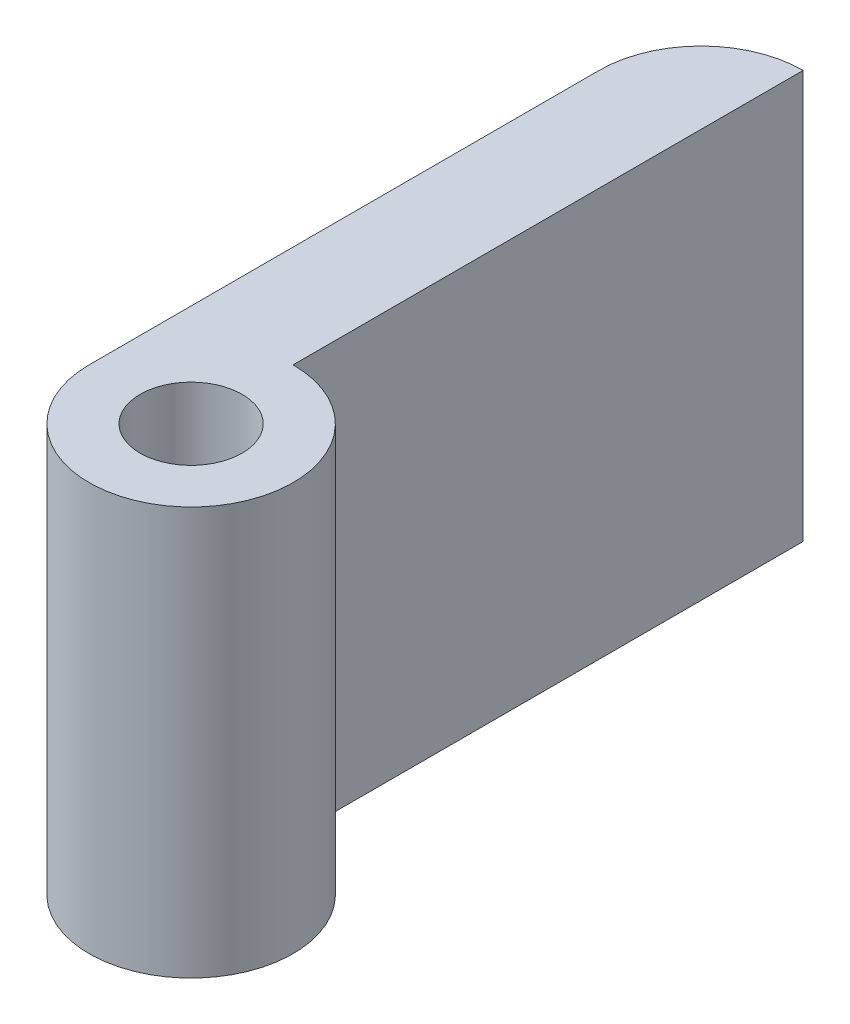
ISO-10303-21;
HEADER;
FILE_DESCRIPTION(('STEP AP214'),'2;1');
FILE_NAME('part.step','',(''),(''),'','','');
FILE_SCHEMA(('AUTOMOTIVE_DESIGN { 1 0 10303 214 1 1 1 1 }'));
ENDSEC;
DATA;
#1=APPLICATION_CONTEXT('core data for automotive mechanical design processes');
#2=APPLICATION_PROTOCOL_DEFINITION('international standard','automotive_design',2000,#1);
#3=PRODUCT_CONTEXT('',#1,'mechanical');
#4=PRODUCT('Part','Part','',(#3));
#5=PRODUCT_RELATED_PRODUCT_CATEGORY('part','',(#4));
#6=PRODUCT_DEFINITION_FORMATION('','',#4);
#7=PRODUCT_DEFINITION_CONTEXT('part definition',#1,'design');
#8=PRODUCT_DEFINITION('design','',#6,#7);
#9=PRODUCT_DEFINITION_SHAPE('','',#8);
#10=(LENGTH_UNIT() NAMED_UNIT(*) SI_UNIT(.MILLI.,.METRE.));
#11=(NAMED_UNIT(*) PLANE_ANGLE_UNIT() SI_UNIT($,.RADIAN.));
#12=(NAMED_UNIT(*) SI_UNIT($,.STERADIAN.) SOLID_ANGLE_UNIT());
#13=UNCERTAINTY_MEASURE_WITH_UNIT(LENGTH_MEASURE(1.E-05),#10,'distance_accuracy_value','');
#14=(GEOMETRIC_REPRESENTATION_CONTEXT(3) GLOBAL_UNCERTAINTY_ASSIGNED_CONTEXT((#13)) GLOBAL_UNIT_ASSIGNED_CONTEXT((#10,
#11,#12)) REPRESENTATION_CONTEXT('',''));
#15=CARTESIAN_POINT('',(0.,0.,0.));
#16=DIRECTION('',(0.,0.,1.));
#17=DIRECTION('',(1.,0.,0.));
#18=AXIS2_PLACEMENT_3D('',#15,#16,#17);
#19=CARTESIAN_POINT('',(0.,20.,0.));
#20=DIRECTION('',(0.,1.,0.));
#21=DIRECTION('',(0.,0.,1.));
#22=AXIS2_PLACEMENT_3D('',#19,#20,#21);
#23=PLANE('',#22);
#24=DIRECTION('',(0.,0.,-1.));
#25=VECTOR('',#24,1.);
#26=CARTESIAN_POINT('',(0.,20.,-30.));
#27=LINE('',#26,#25);
#28=CARTESIAN_POINT('',(0.,20.,-5.00000000000001));
#29=VERTEX_POINT('',#28);
#30=CARTESIAN_POINT('',(0.,20.,-30.));
#31=VERTEX_POINT('',#30);
#32=EDGE_CURVE('E94',#29,#31,#27,.T.);
#33=ORIENTED_EDGE('',*,*,#32,.T.);
#34=CARTESIAN_POINT('',(0.,20.,-25.));
#35=DIRECTION('',(0.,1.,0.));
#36=DIRECTION('',(0.,0.,1.));
#37=AXIS2_PLACEMENT_3D('',#34,#35,#36);
#38=CIRCLE('',#37,5.);
#39=CARTESIAN_POINT('',(-5.,20.,-25.));
#40=VERTEX_POINT('',#39);
#41=EDGE_CURVE('E11',#31,#40,#38,.T.);
#42=ORIENTED_EDGE('',*,*,#41,.T.);
#43=DIRECTION('',(0.,0.,1.));
#44=VECTOR('',#43,1.);
#45=CARTESIAN_POINT('',(-5.,20.,-5.));
#46=LINE('',#45,#44);
#47=CARTESIAN_POINT('',(-5.,20.,0.));
#48=VERTEX_POINT('',#47);
#49=EDGE_CURVE('E72',#40,#48,#46,.T.);
#50=ORIENTED_EDGE('',*,*,#49,.T.);
#51=CARTESIAN_POINT('',(0.,20.,0.));
#52=DIRECTION('',(0.,1.,0.));
#53=DIRECTION('',(0.,0.,1.));
#54=AXIS2_PLACEMENT_3D('',#51,#52,#53);
#55=CIRCLE('',#54,5.);
#56=EDGE_CURVE('E76',#48,#29,#55,.T.);
#57=ORIENTED_EDGE('',*,*,#56,.T.);
#58=EDGE_LOOP('',(#33,#42,#50,#57));
#59=FACE_BOUND('',#58,.T.);
#60=CARTESIAN_POINT('',(0.,20.,0.));
#61=DIRECTION('',(0.,1.,0.));
#62=DIRECTION('',(0.,0.,1.));
#63=AXIS2_PLACEMENT_3D('',#60,#61,#62);
#64=CIRCLE('',#63,2.5);
#65=CARTESIAN_POINT('',(0.,20.,2.5));
#66=VERTEX_POINT('',#65);
#67=EDGE_CURVE('E102',#66,#66,#64,.T.);
#68=ORIENTED_EDGE('',*,*,#67,.F.);
#69=EDGE_LOOP('',(#68));
#70=FACE_BOUND('',#69,.T.);
#71=ADVANCED_FACE('F36',(#59,#70),#23,.T.);
#72=CARTESIAN_POINT('',(0.,0.,0.));
#73=DIRECTION('',(0.,1.,0.));
#74=DIRECTION('',(0.,0.,1.));
#75=AXIS2_PLACEMENT_3D('',#72,#73,#74);
#76=PLANE('',#75);
#77=DIRECTION('',(0.,0.,1.));
#78=VECTOR('',#77,1.);
#79=CARTESIAN_POINT('',(-5.,0.,0.));
#80=LINE('',#79,#78);
#81=CARTESIAN_POINT('',(-5.,0.,-25.));
#82=VERTEX_POINT('',#81);
#83=CARTESIAN_POINT('',(-5.,0.,0.));
#84=VERTEX_POINT('',#83);
#85=EDGE_CURVE('E85',#82,#84,#80,.T.);
#86=ORIENTED_EDGE('',*,*,#85,.F.);
#87=CARTESIAN_POINT('',(0.,0.,-25.));
#88=DIRECTION('',(0.,1.,0.));
#89=DIRECTION('',(0.,0.,1.));
#90=AXIS2_PLACEMENT_3D('',#87,#88,#89);
#91=CIRCLE('',#90,5.);
#92=CARTESIAN_POINT('',(0.,0.,-30.));
#93=VERTEX_POINT('',#92);
#94=EDGE_CURVE('E44',#82,#93,#91,.F.);
#95=ORIENTED_EDGE('',*,*,#94,.T.);
#96=DIRECTION('',(0.,0.,-1.));
#97=VECTOR('',#96,1.);
#98=CARTESIAN_POINT('',(0.,0.,-30.));
#99=LINE('',#98,#97);
#100=CARTESIAN_POINT('',(0.,0.,-5.00000000000001));
#101=VERTEX_POINT('',#100);
#102=EDGE_CURVE('E79',#101,#93,#99,.T.);
#103=ORIENTED_EDGE('',*,*,#102,.F.);
#104=CARTESIAN_POINT('',(0.,0.,0.));
#105=DIRECTION('',(0.,1.,0.));
#106=DIRECTION('',(0.,0.,1.));
#107=AXIS2_PLACEMENT_3D('',#104,#105,#106);
#108=CIRCLE('',#107,5.);
#109=EDGE_CURVE('E101',#84,#101,#108,.T.);
#110=ORIENTED_EDGE('',*,*,#109,.F.);
#111=EDGE_LOOP('',(#86,#95,#103,#110));
#112=FACE_BOUND('',#111,.T.);
#113=CARTESIAN_POINT('',(0.,0.,0.));
#114=DIRECTION('',(0.,1.,0.));
#115=DIRECTION('',(0.,0.,1.));
#116=AXIS2_PLACEMENT_3D('',#113,#114,#115);
#117=CIRCLE('',#116,2.5);
#118=CARTESIAN_POINT('',(0.,0.,2.5));
#119=VERTEX_POINT('',#118);
#120=EDGE_CURVE('E179',#119,#119,#117,.T.);
#121=ORIENTED_EDGE('',*,*,#120,.T.);
#122=EDGE_LOOP('',(#121));
#123=FACE_BOUND('',#122,.T.);
#124=ADVANCED_FACE('F110',(#112,#123),#76,.F.);
#125=CARTESIAN_POINT('',(-5.,20.,0.));
#126=DIRECTION('',(1.,0.,0.));
#127=DIRECTION('',(0.,0.,-1.));
#128=AXIS2_PLACEMENT_3D('',#125,#126,#127);
#129=PLANE('',#128);
#130=ORIENTED_EDGE('',*,*,#49,.F.);
#131=DIRECTION('',(0.,-1.,0.));
#132=VECTOR('',#131,1.);
#133=CARTESIAN_POINT('',(-5.,20.,-25.));
#134=LINE('',#133,#132);
#135=EDGE_CURVE('E88',#40,#82,#134,.T.);
#136=ORIENTED_EDGE('',*,*,#135,.T.);
#137=ORIENTED_EDGE('',*,*,#85,.T.);
#138=DIRECTION('',(0.,-1.,0.));
#139=VECTOR('',#138,1.);
#140=CARTESIAN_POINT('',(-5.,20.,0.));
#141=LINE('',#140,#139);
#142=EDGE_CURVE('E82',#48,#84,#141,.T.);
#143=ORIENTED_EDGE('',*,*,#142,.F.);
#144=EDGE_LOOP('',(#130,#136,#137,#143));
#145=FACE_BOUND('',#144,.T.);
#146=ADVANCED_FACE('F83',(#145),#129,.F.);
#147=CARTESIAN_POINT('',(0.,20.,0.));
#148=DIRECTION('',(0.,-1.,0.));
#149=DIRECTION('',(0.,0.,-1.));
#150=AXIS2_PLACEMENT_3D('',#147,#148,#149);
#151=CYLINDRICAL_SURFACE('',#150,5.);
#152=ORIENTED_EDGE('',*,*,#109,.T.);
#153=DIRECTION('',(0.,-1.,0.));
#154=VECTOR('',#153,1.);
#155=CARTESIAN_POINT('',(0.,20.,-5.00000000000001));
#156=LINE('',#155,#154);
#157=EDGE_CURVE('E89',#29,#101,#156,.T.);
#158=ORIENTED_EDGE('',*,*,#157,.F.);
#159=ORIENTED_EDGE('',*,*,#56,.F.);
#160=ORIENTED_EDGE('',*,*,#142,.T.);
#161=EDGE_LOOP('',(#152,#158,#159,#160));
#162=FACE_BOUND('',#161,.T.);
#163=ADVANCED_FACE('F91',(#162),#151,.T.);
#164=CARTESIAN_POINT('',(0.,20.,-30.));
#165=DIRECTION('',(-1.,0.,0.));
#166=DIRECTION('',(0.,0.,1.));
#167=AXIS2_PLACEMENT_3D('',#164,#165,#166);
#168=PLANE('',#167);
#169=ORIENTED_EDGE('',*,*,#102,.T.);
#170=DIRECTION('',(0.,-1.,0.));
#171=VECTOR('',#170,1.);
#172=CARTESIAN_POINT('',(0.,20.,-30.));
#173=LINE('',#172,#171);
#174=EDGE_CURVE('E96',#31,#93,#173,.T.);
#175=ORIENTED_EDGE('',*,*,#174,.F.);
#176=ORIENTED_EDGE('',*,*,#32,.F.);
#177=ORIENTED_EDGE('',*,*,#157,.T.);
#178=EDGE_LOOP('',(#169,#175,#176,#177));
#179=FACE_BOUND('',#178,.T.);
#180=ADVANCED_FACE('F114',(#179),#168,.F.);
#181=CARTESIAN_POINT('',(0.,20.,0.));
#182=DIRECTION('',(0.,-1.,0.));
#183=DIRECTION('',(0.,0.,-1.));
#184=AXIS2_PLACEMENT_3D('',#181,#182,#183);
#185=CYLINDRICAL_SURFACE('',#184,2.5);
#186=ORIENTED_EDGE('',*,*,#67,.T.);
#187=EDGE_LOOP('',(#186));
#188=FACE_BOUND('',#187,.T.);
#189=ORIENTED_EDGE('',*,*,#120,.F.);
#190=EDGE_LOOP('',(#189));
#191=FACE_BOUND('',#190,.T.);
#192=ADVANCED_FACE('F116',(#188,#191),#185,.F.);
#193=CARTESIAN_POINT('',(0.,20.,-25.));
#194=DIRECTION('',(0.,-1.,0.));
#195=DIRECTION('',(0.,0.,-1.));
#196=AXIS2_PLACEMENT_3D('',#193,#194,#195);
#197=CYLINDRICAL_SURFACE('',#196,5.);
#198=ORIENTED_EDGE('',*,*,#41,.F.);
#199=ORIENTED_EDGE('',*,*,#174,.T.);
#200=ORIENTED_EDGE('',*,*,#94,.F.);
#201=ORIENTED_EDGE('',*,*,#135,.F.);
#202=EDGE_LOOP('',(#198,#199,#200,#201));
#203=FACE_BOUND('',#202,.T.);
#204=ADVANCED_FACE('F38',(#203),#197,.T.);
#205=CLOSED_SHELL('',(#71,#124,#146,#163,#180,#192,#204));
#206=MANIFOLD_SOLID_BREP('B2',#205);
#207=ADVANCED_BREP_SHAPE_REPRESENTATION('',(#18,#206),#14);
#208=SHAPE_DEFINITION_REPRESENTATION(#9,#207);
ENDSEC;
END-ISO-10303-21;
